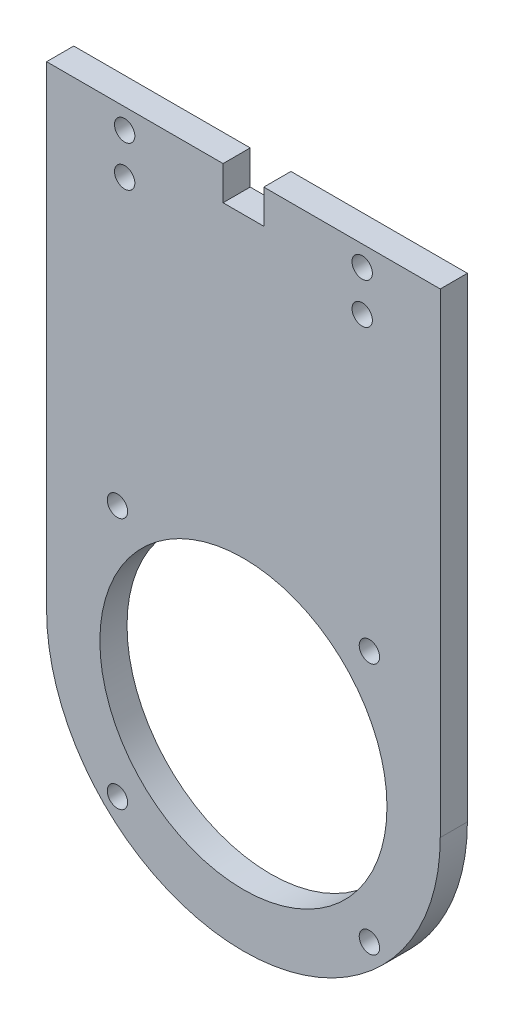
ISO-10303-21;
HEADER;
FILE_DESCRIPTION(('STEP AP214'),'2;1');
FILE_NAME('part.step','',(''),(''),'','','');
FILE_SCHEMA(('AUTOMOTIVE_DESIGN { 1 0 10303 214 1 1 1 1 }'));
ENDSEC;
DATA;
#1=APPLICATION_CONTEXT('core data for automotive mechanical design processes');
#2=APPLICATION_PROTOCOL_DEFINITION('international standard','automotive_design',2000,#1);
#3=PRODUCT_CONTEXT('',#1,'mechanical');
#4=PRODUCT('Part','Part','',(#3));
#5=PRODUCT_RELATED_PRODUCT_CATEGORY('part','',(#4));
#6=PRODUCT_DEFINITION_FORMATION('','',#4);
#7=PRODUCT_DEFINITION_CONTEXT('part definition',#1,'design');
#8=PRODUCT_DEFINITION('design','',#6,#7);
#9=PRODUCT_DEFINITION_SHAPE('','',#8);
#10=(LENGTH_UNIT() NAMED_UNIT(*) SI_UNIT(.MILLI.,.METRE.));
#11=(NAMED_UNIT(*) PLANE_ANGLE_UNIT() SI_UNIT($,.RADIAN.));
#12=(NAMED_UNIT(*) SI_UNIT($,.STERADIAN.) SOLID_ANGLE_UNIT());
#13=UNCERTAINTY_MEASURE_WITH_UNIT(LENGTH_MEASURE(1.E-05),#10,'distance_accuracy_value','');
#14=(GEOMETRIC_REPRESENTATION_CONTEXT(3) GLOBAL_UNCERTAINTY_ASSIGNED_CONTEXT((#13)) GLOBAL_UNIT_ASSIGNED_CONTEXT((#10,
#11,#12)) REPRESENTATION_CONTEXT('',''));
#15=CARTESIAN_POINT('',(0.,0.,0.));
#16=DIRECTION('',(0.,0.,1.));
#17=DIRECTION('',(1.,0.,0.));
#18=AXIS2_PLACEMENT_3D('',#15,#16,#17);
#19=CARTESIAN_POINT('',(0.,6.,4.));
#20=DIRECTION('',(0.,1.,0.));
#21=DIRECTION('',(0.,0.,1.));
#22=AXIS2_PLACEMENT_3D('',#19,#20,#21);
#23=PLANE('',#22);
#24=DIRECTION('',(0.,0.,1.));
#25=VECTOR('',#24,1.);
#26=CARTESIAN_POINT('',(-3.,6.,0.));
#27=LINE('',#26,#25);
#28=CARTESIAN_POINT('',(-3.,6.,0.));
#29=VERTEX_POINT('',#28);
#30=CARTESIAN_POINT('',(-3.,6.,4.));
#31=VERTEX_POINT('',#30);
#32=EDGE_CURVE('E144',#29,#31,#27,.T.);
#33=ORIENTED_EDGE('',*,*,#32,.F.);
#34=DIRECTION('',(1.,0.,0.));
#35=VECTOR('',#34,1.);
#36=CARTESIAN_POINT('',(0.,6.,0.));
#37=LINE('',#36,#35);
#38=CARTESIAN_POINT('',(-29.,6.,0.));
#39=VERTEX_POINT('',#38);
#40=EDGE_CURVE('E137',#39,#29,#37,.T.);
#41=ORIENTED_EDGE('',*,*,#40,.F.);
#42=DIRECTION('',(0.,0.,-1.));
#43=VECTOR('',#42,1.);
#44=CARTESIAN_POINT('',(-29.,6.,4.));
#45=LINE('',#44,#43);
#46=CARTESIAN_POINT('',(-29.,6.,4.));
#47=VERTEX_POINT('',#46);
#48=EDGE_CURVE('E69',#47,#39,#45,.T.);
#49=ORIENTED_EDGE('',*,*,#48,.F.);
#50=DIRECTION('',(1.,0.,0.));
#51=VECTOR('',#50,1.);
#52=CARTESIAN_POINT('',(0.,6.,4.));
#53=LINE('',#52,#51);
#54=EDGE_CURVE('E166',#47,#31,#53,.T.);
#55=ORIENTED_EDGE('',*,*,#54,.T.);
#56=EDGE_LOOP('',(#33,#41,#49,#55));
#57=FACE_BOUND('',#56,.T.);
#58=ADVANCED_FACE('F43',(#57),#23,.T.);
#59=CARTESIAN_POINT('',(-29.,0.,4.));
#60=DIRECTION('',(1.,0.,0.));
#61=DIRECTION('',(0.,1.,0.));
#62=AXIS2_PLACEMENT_3D('',#59,#60,#61);
#63=PLANE('',#62);
#64=DIRECTION('',(0.,-1.,0.));
#65=VECTOR('',#64,1.);
#66=CARTESIAN_POINT('',(-29.,0.,0.));
#67=LINE('',#66,#65);
#68=CARTESIAN_POINT('',(-29.,-64.,0.));
#69=VERTEX_POINT('',#68);
#70=EDGE_CURVE('E197',#39,#69,#67,.T.);
#71=ORIENTED_EDGE('',*,*,#70,.T.);
#72=DIRECTION('',(0.,0.,-1.));
#73=VECTOR('',#72,1.);
#74=CARTESIAN_POINT('',(-29.,-64.,4.));
#75=LINE('',#74,#73);
#76=CARTESIAN_POINT('',(-29.,-64.,4.));
#77=VERTEX_POINT('',#76);
#78=EDGE_CURVE('E11',#77,#69,#75,.T.);
#79=ORIENTED_EDGE('',*,*,#78,.F.);
#80=DIRECTION('',(0.,-1.,0.));
#81=VECTOR('',#80,1.);
#82=CARTESIAN_POINT('',(-29.,0.,4.));
#83=LINE('',#82,#81);
#84=EDGE_CURVE('E165',#47,#77,#83,.T.);
#85=ORIENTED_EDGE('',*,*,#84,.F.);
#86=ORIENTED_EDGE('',*,*,#48,.T.);
#87=EDGE_LOOP('',(#71,#79,#85,#86));
#88=FACE_BOUND('',#87,.T.);
#89=ADVANCED_FACE('F245',(#88),#63,.F.);
#90=CARTESIAN_POINT('',(0.,-64.,4.));
#91=DIRECTION('',(0.,0.,-1.));
#92=DIRECTION('',(-1.,0.,0.));
#93=AXIS2_PLACEMENT_3D('',#90,#91,#92);
#94=CYLINDRICAL_SURFACE('',#93,29.);
#95=CARTESIAN_POINT('',(0.,-64.,0.));
#96=DIRECTION('',(0.,0.,1.));
#97=DIRECTION('',(1.,0.,0.));
#98=AXIS2_PLACEMENT_3D('',#95,#96,#97);
#99=CIRCLE('',#98,29.);
#100=CARTESIAN_POINT('',(29.,-64.,0.));
#101=VERTEX_POINT('',#100);
#102=EDGE_CURVE('E200',#69,#101,#99,.T.);
#103=ORIENTED_EDGE('',*,*,#102,.T.);
#104=DIRECTION('',(0.,0.,-1.));
#105=VECTOR('',#104,1.);
#106=CARTESIAN_POINT('',(29.,-64.,4.));
#107=LINE('',#106,#105);
#108=CARTESIAN_POINT('',(29.,-64.,4.));
#109=VERTEX_POINT('',#108);
#110=EDGE_CURVE('E51',#109,#101,#107,.T.);
#111=ORIENTED_EDGE('',*,*,#110,.F.);
#112=CARTESIAN_POINT('',(0.,-64.,4.));
#113=DIRECTION('',(0.,0.,1.));
#114=DIRECTION('',(1.,0.,0.));
#115=AXIS2_PLACEMENT_3D('',#112,#113,#114);
#116=CIRCLE('',#115,29.);
#117=EDGE_CURVE('E91',#77,#109,#116,.T.);
#118=ORIENTED_EDGE('',*,*,#117,.F.);
#119=ORIENTED_EDGE('',*,*,#78,.T.);
#120=EDGE_LOOP('',(#103,#111,#118,#119));
#121=FACE_BOUND('',#120,.T.);
#122=ADVANCED_FACE('F234',(#121),#94,.T.);
#123=CARTESIAN_POINT('',(29.,0.,4.));
#124=DIRECTION('',(1.,0.,0.));
#125=DIRECTION('',(0.,1.,0.));
#126=AXIS2_PLACEMENT_3D('',#123,#124,#125);
#127=PLANE('',#126);
#128=DIRECTION('',(0.,-1.,0.));
#129=VECTOR('',#128,1.);
#130=CARTESIAN_POINT('',(29.,0.,0.));
#131=LINE('',#130,#129);
#132=CARTESIAN_POINT('',(29.,6.,0.));
#133=VERTEX_POINT('',#132);
#134=EDGE_CURVE('E205',#133,#101,#131,.T.);
#135=ORIENTED_EDGE('',*,*,#134,.F.);
#136=DIRECTION('',(0.,0.,-1.));
#137=VECTOR('',#136,1.);
#138=CARTESIAN_POINT('',(29.,6.,4.));
#139=LINE('',#138,#137);
#140=CARTESIAN_POINT('',(29.,6.,4.));
#141=VERTEX_POINT('',#140);
#142=EDGE_CURVE('E223',#141,#133,#139,.T.);
#143=ORIENTED_EDGE('',*,*,#142,.F.);
#144=DIRECTION('',(0.,-1.,0.));
#145=VECTOR('',#144,1.);
#146=CARTESIAN_POINT('',(29.,0.,4.));
#147=LINE('',#146,#145);
#148=EDGE_CURVE('E164',#141,#109,#147,.T.);
#149=ORIENTED_EDGE('',*,*,#148,.T.);
#150=ORIENTED_EDGE('',*,*,#110,.T.);
#151=EDGE_LOOP('',(#135,#143,#149,#150));
#152=FACE_BOUND('',#151,.T.);
#153=ADVANCED_FACE('F226',(#152),#127,.T.);
#154=CARTESIAN_POINT('',(-17.4999999999999,-3.,4.));
#155=DIRECTION('',(0.,0.,-1.));
#156=DIRECTION('',(-1.,0.,0.));
#157=AXIS2_PLACEMENT_3D('',#154,#155,#156);
#158=CYLINDRICAL_SURFACE('',#157,1.5);
#159=CARTESIAN_POINT('',(-17.4999999999999,-3.,4.));
#160=DIRECTION('',(0.,0.,1.));
#161=DIRECTION('',(1.,0.,0.));
#162=AXIS2_PLACEMENT_3D('',#159,#160,#161);
#163=CIRCLE('',#162,1.5);
#164=CARTESIAN_POINT('',(-15.9999999999999,-3.,4.));
#165=VERTEX_POINT('',#164);
#166=EDGE_CURVE('E181',#165,#165,#163,.T.);
#167=ORIENTED_EDGE('',*,*,#166,.T.);
#168=EDGE_LOOP('',(#167));
#169=FACE_BOUND('',#168,.T.);
#170=CARTESIAN_POINT('',(-17.4999999999999,-3.,0.));
#171=DIRECTION('',(0.,0.,1.));
#172=DIRECTION('',(1.,0.,0.));
#173=AXIS2_PLACEMENT_3D('',#170,#171,#172);
#174=CIRCLE('',#173,1.5);
#175=CARTESIAN_POINT('',(-15.9999999999999,-3.,0.));
#176=VERTEX_POINT('',#175);
#177=EDGE_CURVE('E218',#176,#176,#174,.T.);
#178=ORIENTED_EDGE('',*,*,#177,.F.);
#179=EDGE_LOOP('',(#178));
#180=FACE_BOUND('',#179,.T.);
#181=ADVANCED_FACE('F286',(#169,#180),#158,.F.);
#182=CARTESIAN_POINT('',(18.5615530061469,-45.4384469938532,4.));
#183=DIRECTION('',(0.,0.,-1.));
#184=DIRECTION('',(-1.,0.,0.));
#185=AXIS2_PLACEMENT_3D('',#182,#183,#184);
#186=CYLINDRICAL_SURFACE('',#185,1.5);
#187=CARTESIAN_POINT('',(18.5615530061469,-45.4384469938532,4.));
#188=DIRECTION('',(0.,0.,1.));
#189=DIRECTION('',(1.,0.,0.));
#190=AXIS2_PLACEMENT_3D('',#187,#188,#189);
#191=CIRCLE('',#190,1.5);
#192=CARTESIAN_POINT('',(20.0615530061469,-45.4384469938532,4.));
#193=VERTEX_POINT('',#192);
#194=EDGE_CURVE('E178',#193,#193,#191,.T.);
#195=ORIENTED_EDGE('',*,*,#194,.T.);
#196=EDGE_LOOP('',(#195));
#197=FACE_BOUND('',#196,.T.);
#198=CARTESIAN_POINT('',(18.5615530061469,-45.4384469938532,0.));
#199=DIRECTION('',(0.,0.,1.));
#200=DIRECTION('',(1.,0.,0.));
#201=AXIS2_PLACEMENT_3D('',#198,#199,#200);
#202=CIRCLE('',#201,1.5);
#203=CARTESIAN_POINT('',(20.0615530061469,-45.4384469938532,0.));
#204=VERTEX_POINT('',#203);
#205=EDGE_CURVE('E216',#204,#204,#202,.T.);
#206=ORIENTED_EDGE('',*,*,#205,.F.);
#207=EDGE_LOOP('',(#206));
#208=FACE_BOUND('',#207,.T.);
#209=ADVANCED_FACE('F283',(#197,#208),#186,.F.);
#210=CARTESIAN_POINT('',(-18.5615530061468,-45.4384469938531,4.));
#211=DIRECTION('',(0.,0.,-1.));
#212=DIRECTION('',(-1.,0.,0.));
#213=AXIS2_PLACEMENT_3D('',#210,#211,#212);
#214=CYLINDRICAL_SURFACE('',#213,1.5);
#215=CARTESIAN_POINT('',(-18.5615530061468,-45.4384469938531,4.));
#216=DIRECTION('',(0.,0.,1.));
#217=DIRECTION('',(1.,0.,0.));
#218=AXIS2_PLACEMENT_3D('',#215,#216,#217);
#219=CIRCLE('',#218,1.5);
#220=CARTESIAN_POINT('',(-17.0615530061468,-45.4384469938531,4.));
#221=VERTEX_POINT('',#220);
#222=EDGE_CURVE('E179',#221,#221,#219,.T.);
#223=ORIENTED_EDGE('',*,*,#222,.T.);
#224=EDGE_LOOP('',(#223));
#225=FACE_BOUND('',#224,.T.);
#226=CARTESIAN_POINT('',(-18.5615530061468,-45.4384469938531,0.));
#227=DIRECTION('',(0.,0.,1.));
#228=DIRECTION('',(1.,0.,0.));
#229=AXIS2_PLACEMENT_3D('',#226,#227,#228);
#230=CIRCLE('',#229,1.5);
#231=CARTESIAN_POINT('',(-17.0615530061468,-45.4384469938531,0.));
#232=VERTEX_POINT('',#231);
#233=EDGE_CURVE('E213',#232,#232,#230,.T.);
#234=ORIENTED_EDGE('',*,*,#233,.F.);
#235=EDGE_LOOP('',(#234));
#236=FACE_BOUND('',#235,.T.);
#237=ADVANCED_FACE('F279',(#225,#236),#214,.F.);
#238=CARTESIAN_POINT('',(-18.5615530061469,-82.5615530061468,4.));
#239=DIRECTION('',(0.,0.,-1.));
#240=DIRECTION('',(-1.,0.,0.));
#241=AXIS2_PLACEMENT_3D('',#238,#239,#240);
#242=CYLINDRICAL_SURFACE('',#241,1.49999999999999);
#243=CARTESIAN_POINT('',(-18.5615530061469,-82.5615530061468,4.));
#244=DIRECTION('',(0.,0.,1.));
#245=DIRECTION('',(1.,0.,0.));
#246=AXIS2_PLACEMENT_3D('',#243,#244,#245);
#247=CIRCLE('',#246,1.49999999999999);
#248=CARTESIAN_POINT('',(-17.0615530061469,-82.5615530061468,4.));
#249=VERTEX_POINT('',#248);
#250=EDGE_CURVE('E171',#249,#249,#247,.T.);
#251=ORIENTED_EDGE('',*,*,#250,.T.);
#252=EDGE_LOOP('',(#251));
#253=FACE_BOUND('',#252,.T.);
#254=CARTESIAN_POINT('',(-18.5615530061469,-82.5615530061468,0.));
#255=DIRECTION('',(0.,0.,1.));
#256=DIRECTION('',(1.,0.,0.));
#257=AXIS2_PLACEMENT_3D('',#254,#255,#256);
#258=CIRCLE('',#257,1.49999999999999);
#259=CARTESIAN_POINT('',(-17.0615530061469,-82.5615530061468,0.));
#260=VERTEX_POINT('',#259);
#261=EDGE_CURVE('E209',#260,#260,#258,.T.);
#262=ORIENTED_EDGE('',*,*,#261,.F.);
#263=EDGE_LOOP('',(#262));
#264=FACE_BOUND('',#263,.T.);
#265=ADVANCED_FACE('F272',(#253,#264),#242,.F.);
#266=CARTESIAN_POINT('',(18.5615530061468,-82.5615530061469,4.));
#267=DIRECTION('',(0.,0.,-1.));
#268=DIRECTION('',(-1.,0.,0.));
#269=AXIS2_PLACEMENT_3D('',#266,#267,#268);
#270=CYLINDRICAL_SURFACE('',#269,1.50000000000001);
#271=CARTESIAN_POINT('',(18.5615530061468,-82.5615530061469,4.));
#272=DIRECTION('',(0.,0.,1.));
#273=DIRECTION('',(1.,0.,0.));
#274=AXIS2_PLACEMENT_3D('',#271,#272,#273);
#275=CIRCLE('',#274,1.50000000000001);
#276=CARTESIAN_POINT('',(20.0615530061469,-82.5615530061469,4.));
#277=VERTEX_POINT('',#276);
#278=EDGE_CURVE('E172',#277,#277,#275,.T.);
#279=ORIENTED_EDGE('',*,*,#278,.T.);
#280=EDGE_LOOP('',(#279));
#281=FACE_BOUND('',#280,.T.);
#282=CARTESIAN_POINT('',(18.5615530061468,-82.5615530061469,0.));
#283=DIRECTION('',(0.,0.,1.));
#284=DIRECTION('',(1.,0.,0.));
#285=AXIS2_PLACEMENT_3D('',#282,#283,#284);
#286=CIRCLE('',#285,1.50000000000001);
#287=CARTESIAN_POINT('',(20.0615530061469,-82.5615530061469,0.));
#288=VERTEX_POINT('',#287);
#289=EDGE_CURVE('E210',#288,#288,#286,.T.);
#290=ORIENTED_EDGE('',*,*,#289,.F.);
#291=EDGE_LOOP('',(#290));
#292=FACE_BOUND('',#291,.T.);
#293=ADVANCED_FACE('F262',(#281,#292),#270,.F.);
#294=DIRECTION('',(0.,0.,1.));
#295=VECTOR('',#294,1.);
#296=CARTESIAN_POINT('',(3.,6.,0.));
#297=LINE('',#296,#295);
#298=CARTESIAN_POINT('',(3.,6.,0.));
#299=VERTEX_POINT('',#298);
#300=CARTESIAN_POINT('',(3.,6.,4.));
#301=VERTEX_POINT('',#300);
#302=EDGE_CURVE('E146',#299,#301,#297,.T.);
#303=ORIENTED_EDGE('',*,*,#302,.T.);
#304=EDGE_CURVE('E169',#301,#141,#53,.T.);
#305=ORIENTED_EDGE('',*,*,#304,.T.);
#306=ORIENTED_EDGE('',*,*,#142,.T.);
#307=EDGE_CURVE('E202',#299,#133,#37,.T.);
#308=ORIENTED_EDGE('',*,*,#307,.F.);
#309=EDGE_LOOP('',(#303,#305,#306,#308));
#310=FACE_BOUND('',#309,.T.);
#311=ADVANCED_FACE('F237',(#310),#23,.T.);
#312=CARTESIAN_POINT('',(0.,-64.,4.));
#313=DIRECTION('',(0.,0.,-1.));
#314=DIRECTION('',(-1.,0.,0.));
#315=AXIS2_PLACEMENT_3D('',#312,#313,#314);
#316=CYLINDRICAL_SURFACE('',#315,21.15);
#317=CARTESIAN_POINT('',(0.,-64.,4.));
#318=DIRECTION('',(0.,0.,1.));
#319=DIRECTION('',(1.,0.,0.));
#320=AXIS2_PLACEMENT_3D('',#317,#318,#319);
#321=CIRCLE('',#320,21.15);
#322=CARTESIAN_POINT('',(21.15,-64.,4.));
#323=VERTEX_POINT('',#322);
#324=EDGE_CURVE('E157',#323,#323,#321,.T.);
#325=ORIENTED_EDGE('',*,*,#324,.T.);
#326=EDGE_LOOP('',(#325));
#327=FACE_BOUND('',#326,.T.);
#328=CARTESIAN_POINT('',(0.,-64.,0.));
#329=DIRECTION('',(0.,0.,1.));
#330=DIRECTION('',(1.,0.,0.));
#331=AXIS2_PLACEMENT_3D('',#328,#329,#330);
#332=CIRCLE('',#331,21.15);
#333=CARTESIAN_POINT('',(21.15,-64.,0.));
#334=VERTEX_POINT('',#333);
#335=EDGE_CURVE('E191',#334,#334,#332,.T.);
#336=ORIENTED_EDGE('',*,*,#335,.F.);
#337=EDGE_LOOP('',(#336));
#338=FACE_BOUND('',#337,.T.);
#339=ADVANCED_FACE('F263',(#327,#338),#316,.F.);
#340=CARTESIAN_POINT('',(-17.5,3.,4.));
#341=DIRECTION('',(0.,0.,-1.));
#342=DIRECTION('',(-1.,0.,0.));
#343=AXIS2_PLACEMENT_3D('',#340,#341,#342);
#344=CYLINDRICAL_SURFACE('',#343,1.5);
#345=CARTESIAN_POINT('',(-17.5,3.,4.));
#346=DIRECTION('',(0.,0.,1.));
#347=DIRECTION('',(1.,0.,0.));
#348=AXIS2_PLACEMENT_3D('',#345,#346,#347);
#349=CIRCLE('',#348,1.5);
#350=CARTESIAN_POINT('',(-16.,3.,4.));
#351=VERTEX_POINT('',#350);
#352=EDGE_CURVE('E154',#351,#351,#349,.T.);
#353=ORIENTED_EDGE('',*,*,#352,.T.);
#354=EDGE_LOOP('',(#353));
#355=FACE_BOUND('',#354,.T.);
#356=CARTESIAN_POINT('',(-17.5,3.,0.));
#357=DIRECTION('',(0.,0.,1.));
#358=DIRECTION('',(1.,0.,0.));
#359=AXIS2_PLACEMENT_3D('',#356,#357,#358);
#360=CIRCLE('',#359,1.5);
#361=CARTESIAN_POINT('',(-16.,3.,0.));
#362=VERTEX_POINT('',#361);
#363=EDGE_CURVE('E192',#362,#362,#360,.T.);
#364=ORIENTED_EDGE('',*,*,#363,.F.);
#365=EDGE_LOOP('',(#364));
#366=FACE_BOUND('',#365,.T.);
#367=ADVANCED_FACE('F267',(#355,#366),#344,.F.);
#368=CARTESIAN_POINT('',(17.5,3.,4.));
#369=DIRECTION('',(0.,0.,-1.));
#370=DIRECTION('',(-1.,0.,0.));
#371=AXIS2_PLACEMENT_3D('',#368,#369,#370);
#372=CYLINDRICAL_SURFACE('',#371,1.5);
#373=CARTESIAN_POINT('',(17.5,3.,4.));
#374=DIRECTION('',(0.,0.,1.));
#375=DIRECTION('',(1.,0.,0.));
#376=AXIS2_PLACEMENT_3D('',#373,#374,#375);
#377=CIRCLE('',#376,1.5);
#378=CARTESIAN_POINT('',(19.,3.,4.));
#379=VERTEX_POINT('',#378);
#380=EDGE_CURVE('E155',#379,#379,#377,.F.);
#381=ORIENTED_EDGE('',*,*,#380,.F.);
#382=EDGE_LOOP('',(#381));
#383=FACE_BOUND('',#382,.T.);
#384=CARTESIAN_POINT('',(17.5,3.,0.));
#385=DIRECTION('',(0.,0.,1.));
#386=DIRECTION('',(1.,0.,0.));
#387=AXIS2_PLACEMENT_3D('',#384,#385,#386);
#388=CIRCLE('',#387,1.5);
#389=CARTESIAN_POINT('',(19.,3.,0.));
#390=VERTEX_POINT('',#389);
#391=EDGE_CURVE('E150',#390,#390,#388,.F.);
#392=ORIENTED_EDGE('',*,*,#391,.T.);
#393=EDGE_LOOP('',(#392));
#394=FACE_BOUND('',#393,.T.);
#395=ADVANCED_FACE('F44',(#383,#394),#372,.F.);
#396=CARTESIAN_POINT('',(17.5000000000001,-3.,4.));
#397=DIRECTION('',(0.,0.,-1.));
#398=DIRECTION('',(-1.,0.,0.));
#399=AXIS2_PLACEMENT_3D('',#396,#397,#398);
#400=CYLINDRICAL_SURFACE('',#399,1.5);
#401=CARTESIAN_POINT('',(17.5000000000001,-3.,4.));
#402=DIRECTION('',(0.,0.,1.));
#403=DIRECTION('',(1.,0.,0.));
#404=AXIS2_PLACEMENT_3D('',#401,#402,#403);
#405=CIRCLE('',#404,1.5);
#406=CARTESIAN_POINT('',(19.0000000000001,-3.,4.));
#407=VERTEX_POINT('',#406);
#408=EDGE_CURVE('E187',#407,#407,#405,.F.);
#409=ORIENTED_EDGE('',*,*,#408,.F.);
#410=EDGE_LOOP('',(#409));
#411=FACE_BOUND('',#410,.T.);
#412=CARTESIAN_POINT('',(17.5000000000001,-3.,0.));
#413=DIRECTION('',(0.,0.,1.));
#414=DIRECTION('',(1.,0.,0.));
#415=AXIS2_PLACEMENT_3D('',#412,#413,#414);
#416=CIRCLE('',#415,1.5);
#417=CARTESIAN_POINT('',(19.0000000000001,-3.,0.));
#418=VERTEX_POINT('',#417);
#419=EDGE_CURVE('E156',#418,#418,#416,.F.);
#420=ORIENTED_EDGE('',*,*,#419,.T.);
#421=EDGE_LOOP('',(#420));
#422=FACE_BOUND('',#421,.T.);
#423=ADVANCED_FACE('F294',(#411,#422),#400,.F.);
#424=CARTESIAN_POINT('',(0.,0.,4.));
#425=DIRECTION('',(0.,0.,1.));
#426=DIRECTION('',(1.,0.,0.));
#427=AXIS2_PLACEMENT_3D('',#424,#425,#426);
#428=PLANE('',#427);
#429=DIRECTION('',(0.,-1.,0.));
#430=VECTOR('',#429,1.);
#431=CARTESIAN_POINT('',(-3.,6.,4.));
#432=LINE('',#431,#430);
#433=CARTESIAN_POINT('',(-3.,0.999999999999997,4.));
#434=VERTEX_POINT('',#433);
#435=EDGE_CURVE('E124',#31,#434,#432,.T.);
#436=ORIENTED_EDGE('',*,*,#435,.F.);
#437=ORIENTED_EDGE('',*,*,#54,.F.);
#438=ORIENTED_EDGE('',*,*,#84,.T.);
#439=ORIENTED_EDGE('',*,*,#117,.T.);
#440=ORIENTED_EDGE('',*,*,#148,.F.);
#441=ORIENTED_EDGE('',*,*,#304,.F.);
#442=DIRECTION('',(0.,1.,0.));
#443=VECTOR('',#442,1.);
#444=CARTESIAN_POINT('',(3.,6.,4.));
#445=LINE('',#444,#443);
#446=CARTESIAN_POINT('',(3.,0.999999999999997,4.));
#447=VERTEX_POINT('',#446);
#448=EDGE_CURVE('E139',#447,#301,#445,.T.);
#449=ORIENTED_EDGE('',*,*,#448,.F.);
#450=DIRECTION('',(1.,0.,0.));
#451=VECTOR('',#450,1.);
#452=CARTESIAN_POINT('',(-3.,0.999999999999997,4.));
#453=LINE('',#452,#451);
#454=EDGE_CURVE('E136',#434,#447,#453,.T.);
#455=ORIENTED_EDGE('',*,*,#454,.F.);
#456=EDGE_LOOP('',(#436,#437,#438,#439,#440,#441,#449,#455));
#457=FACE_BOUND('',#456,.T.);
#458=ORIENTED_EDGE('',*,*,#380,.T.);
#459=EDGE_LOOP('',(#458));
#460=FACE_BOUND('',#459,.T.);
#461=ORIENTED_EDGE('',*,*,#352,.F.);
#462=EDGE_LOOP('',(#461));
#463=FACE_BOUND('',#462,.T.);
#464=ORIENTED_EDGE('',*,*,#324,.F.);
#465=EDGE_LOOP('',(#464));
#466=FACE_BOUND('',#465,.T.);
#467=ORIENTED_EDGE('',*,*,#278,.F.);
#468=EDGE_LOOP('',(#467));
#469=FACE_BOUND('',#468,.T.);
#470=ORIENTED_EDGE('',*,*,#250,.F.);
#471=EDGE_LOOP('',(#470));
#472=FACE_BOUND('',#471,.T.);
#473=ORIENTED_EDGE('',*,*,#222,.F.);
#474=EDGE_LOOP('',(#473));
#475=FACE_BOUND('',#474,.T.);
#476=ORIENTED_EDGE('',*,*,#194,.F.);
#477=EDGE_LOOP('',(#476));
#478=FACE_BOUND('',#477,.T.);
#479=ORIENTED_EDGE('',*,*,#166,.F.);
#480=EDGE_LOOP('',(#479));
#481=FACE_BOUND('',#480,.T.);
#482=ORIENTED_EDGE('',*,*,#408,.T.);
#483=EDGE_LOOP('',(#482));
#484=FACE_BOUND('',#483,.T.);
#485=ADVANCED_FACE('F239',(#457,#460,#463,#466,#469,#472,#475,#478,#481,#484),#428,.T.);
#486=CARTESIAN_POINT('',(0.,0.,0.));
#487=DIRECTION('',(0.,0.,1.));
#488=DIRECTION('',(1.,0.,0.));
#489=AXIS2_PLACEMENT_3D('',#486,#487,#488);
#490=PLANE('',#489);
#491=ORIENTED_EDGE('',*,*,#40,.T.);
#492=DIRECTION('',(0.,-1.,0.));
#493=VECTOR('',#492,1.);
#494=CARTESIAN_POINT('',(-3.,6.,0.));
#495=LINE('',#494,#493);
#496=CARTESIAN_POINT('',(-3.,0.999999999999997,0.));
#497=VERTEX_POINT('',#496);
#498=EDGE_CURVE('E116',#29,#497,#495,.T.);
#499=ORIENTED_EDGE('',*,*,#498,.T.);
#500=DIRECTION('',(1.,0.,0.));
#501=VECTOR('',#500,1.);
#502=CARTESIAN_POINT('',(-3.,0.999999999999997,0.));
#503=LINE('',#502,#501);
#504=CARTESIAN_POINT('',(3.,0.999999999999997,0.));
#505=VERTEX_POINT('',#504);
#506=EDGE_CURVE('E129',#497,#505,#503,.T.);
#507=ORIENTED_EDGE('',*,*,#506,.T.);
#508=DIRECTION('',(0.,1.,0.));
#509=VECTOR('',#508,1.);
#510=CARTESIAN_POINT('',(3.,6.,0.));
#511=LINE('',#510,#509);
#512=EDGE_CURVE('E59',#505,#299,#511,.T.);
#513=ORIENTED_EDGE('',*,*,#512,.T.);
#514=ORIENTED_EDGE('',*,*,#307,.T.);
#515=ORIENTED_EDGE('',*,*,#134,.T.);
#516=ORIENTED_EDGE('',*,*,#102,.F.);
#517=ORIENTED_EDGE('',*,*,#70,.F.);
#518=EDGE_LOOP('',(#491,#499,#507,#513,#514,#515,#516,#517));
#519=FACE_BOUND('',#518,.T.);
#520=ORIENTED_EDGE('',*,*,#391,.F.);
#521=EDGE_LOOP('',(#520));
#522=FACE_BOUND('',#521,.T.);
#523=ORIENTED_EDGE('',*,*,#363,.T.);
#524=EDGE_LOOP('',(#523));
#525=FACE_BOUND('',#524,.T.);
#526=ORIENTED_EDGE('',*,*,#335,.T.);
#527=EDGE_LOOP('',(#526));
#528=FACE_BOUND('',#527,.T.);
#529=ORIENTED_EDGE('',*,*,#289,.T.);
#530=EDGE_LOOP('',(#529));
#531=FACE_BOUND('',#530,.T.);
#532=ORIENTED_EDGE('',*,*,#261,.T.);
#533=EDGE_LOOP('',(#532));
#534=FACE_BOUND('',#533,.T.);
#535=ORIENTED_EDGE('',*,*,#233,.T.);
#536=EDGE_LOOP('',(#535));
#537=FACE_BOUND('',#536,.T.);
#538=ORIENTED_EDGE('',*,*,#205,.T.);
#539=EDGE_LOOP('',(#538));
#540=FACE_BOUND('',#539,.T.);
#541=ORIENTED_EDGE('',*,*,#177,.T.);
#542=EDGE_LOOP('',(#541));
#543=FACE_BOUND('',#542,.T.);
#544=ORIENTED_EDGE('',*,*,#419,.F.);
#545=EDGE_LOOP('',(#544));
#546=FACE_BOUND('',#545,.T.);
#547=ADVANCED_FACE('F131',(#519,#522,#525,#528,#531,#534,#537,#540,#543,#546),#490,.F.);
#548=CARTESIAN_POINT('',(-3.,6.,0.));
#549=DIRECTION('',(-1.,0.,0.));
#550=DIRECTION('',(0.,-1.,0.));
#551=AXIS2_PLACEMENT_3D('',#548,#549,#550);
#552=PLANE('',#551);
#553=ORIENTED_EDGE('',*,*,#435,.T.);
#554=DIRECTION('',(0.,0.,1.));
#555=VECTOR('',#554,1.);
#556=CARTESIAN_POINT('',(-3.,0.999999999999997,0.));
#557=LINE('',#556,#555);
#558=EDGE_CURVE('E113',#497,#434,#557,.T.);
#559=ORIENTED_EDGE('',*,*,#558,.F.);
#560=ORIENTED_EDGE('',*,*,#498,.F.);
#561=ORIENTED_EDGE('',*,*,#32,.T.);
#562=EDGE_LOOP('',(#553,#559,#560,#561));
#563=FACE_BOUND('',#562,.T.);
#564=ADVANCED_FACE('F119',(#563),#552,.F.);
#565=CARTESIAN_POINT('',(3.,6.,0.));
#566=DIRECTION('',(1.,0.,0.));
#567=DIRECTION('',(0.,1.,0.));
#568=AXIS2_PLACEMENT_3D('',#565,#566,#567);
#569=PLANE('',#568);
#570=ORIENTED_EDGE('',*,*,#448,.T.);
#571=ORIENTED_EDGE('',*,*,#302,.F.);
#572=ORIENTED_EDGE('',*,*,#512,.F.);
#573=DIRECTION('',(0.,0.,1.));
#574=VECTOR('',#573,1.);
#575=CARTESIAN_POINT('',(3.,0.999999999999997,0.));
#576=LINE('',#575,#574);
#577=EDGE_CURVE('E127',#505,#447,#576,.T.);
#578=ORIENTED_EDGE('',*,*,#577,.T.);
#579=EDGE_LOOP('',(#570,#571,#572,#578));
#580=FACE_BOUND('',#579,.T.);
#581=ADVANCED_FACE('F241',(#580),#569,.F.);
#582=CARTESIAN_POINT('',(-3.,0.999999999999997,0.));
#583=DIRECTION('',(0.,-1.,0.));
#584=DIRECTION('',(0.,0.,-1.));
#585=AXIS2_PLACEMENT_3D('',#582,#583,#584);
#586=PLANE('',#585);
#587=ORIENTED_EDGE('',*,*,#454,.T.);
#588=ORIENTED_EDGE('',*,*,#577,.F.);
#589=ORIENTED_EDGE('',*,*,#506,.F.);
#590=ORIENTED_EDGE('',*,*,#558,.T.);
#591=EDGE_LOOP('',(#587,#588,#589,#590));
#592=FACE_BOUND('',#591,.T.);
#593=ADVANCED_FACE('F128',(#592),#586,.F.);
#594=CLOSED_SHELL('',(#58,#89,#122,#153,#181,#209,#237,#265,#293,#311,#339,#367,#395,#423,#485,
#547,#564,#581,#593));
#595=MANIFOLD_SOLID_BREP('B2',#594);
#596=ADVANCED_BREP_SHAPE_REPRESENTATION('',(#18,#595),#14);
#597=SHAPE_DEFINITION_REPRESENTATION(#9,#596);
ENDSEC;
END-ISO-10303-21;
